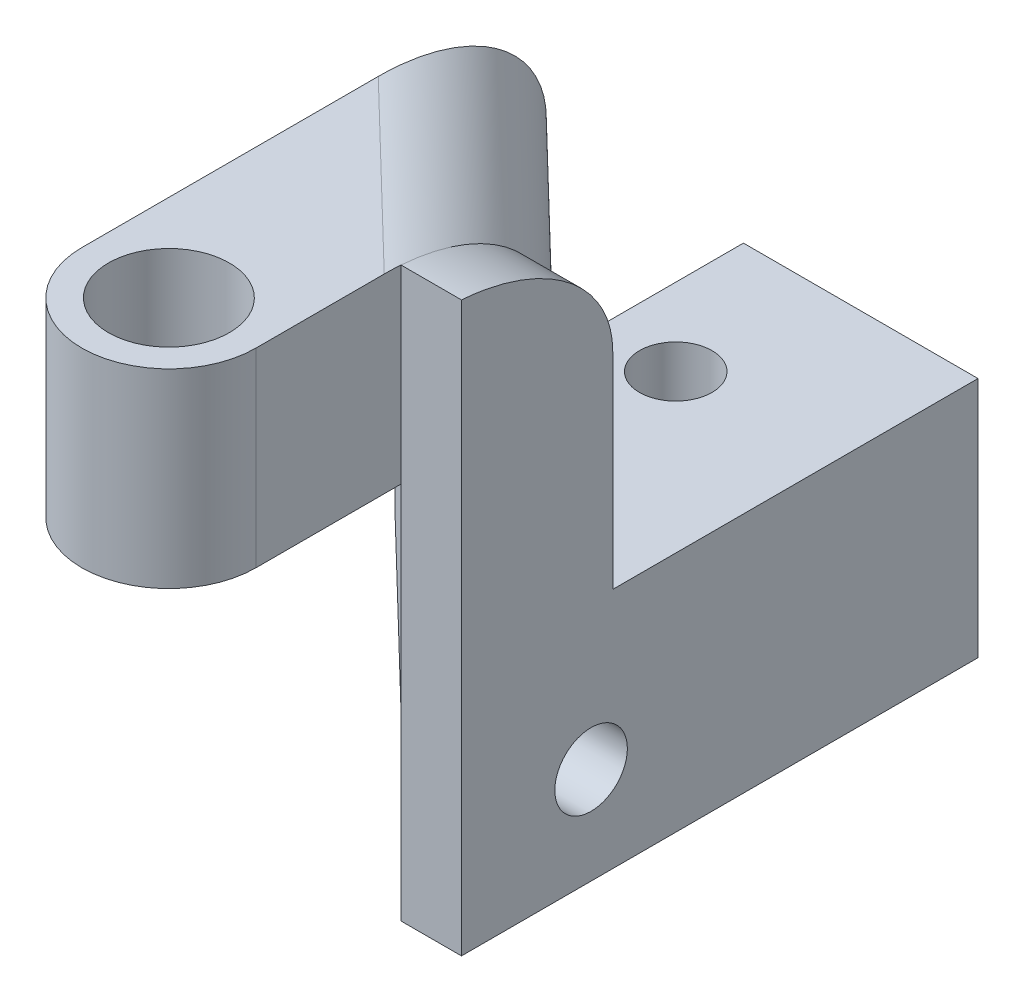
ISO-10303-21;
HEADER;
FILE_DESCRIPTION(('STEP AP214'),'2;1');
FILE_NAME('part.step','',(''),(''),'','','');
FILE_SCHEMA(('AUTOMOTIVE_DESIGN { 1 0 10303 214 1 1 1 1 }'));
ENDSEC;
DATA;
#1=APPLICATION_CONTEXT('core data for automotive mechanical design processes');
#2=APPLICATION_PROTOCOL_DEFINITION('international standard','automotive_design',2000,#1);
#3=PRODUCT_CONTEXT('',#1,'mechanical');
#4=PRODUCT('Part','Part','',(#3));
#5=PRODUCT_RELATED_PRODUCT_CATEGORY('part','',(#4));
#6=PRODUCT_DEFINITION_FORMATION('','',#4);
#7=PRODUCT_DEFINITION_CONTEXT('part definition',#1,'design');
#8=PRODUCT_DEFINITION('design','',#6,#7);
#9=PRODUCT_DEFINITION_SHAPE('','',#8);
#10=(LENGTH_UNIT() NAMED_UNIT(*) SI_UNIT(.MILLI.,.METRE.));
#11=(NAMED_UNIT(*) PLANE_ANGLE_UNIT() SI_UNIT($,.RADIAN.));
#12=(NAMED_UNIT(*) SI_UNIT($,.STERADIAN.) SOLID_ANGLE_UNIT());
#13=UNCERTAINTY_MEASURE_WITH_UNIT(LENGTH_MEASURE(1.E-05),#10,'distance_accuracy_value','');
#14=(GEOMETRIC_REPRESENTATION_CONTEXT(3) GLOBAL_UNCERTAINTY_ASSIGNED_CONTEXT((#13)) GLOBAL_UNIT_ASSIGNED_CONTEXT((#10,
#11,#12)) REPRESENTATION_CONTEXT('',''));
#15=CARTESIAN_POINT('',(0.,0.,0.));
#16=DIRECTION('',(0.,0.,1.));
#17=DIRECTION('',(1.,0.,0.));
#18=AXIS2_PLACEMENT_3D('',#15,#16,#17);
#19=CARTESIAN_POINT('',(4.73535338699276,2.5,-4.9036019787419));
#20=DIRECTION('',(0.694658370458993,0.,-0.719339800338655));
#21=DIRECTION('',(-0.719339800338655,0.,-0.694658370458993));
#22=AXIS2_PLACEMENT_3D('',#19,#20,#21);
#23=PLANE('',#22);
#24=DIRECTION('',(0.719339800338655,0.,0.694658370458993));
#25=VECTOR('',#24,1.);
#26=CARTESIAN_POINT('',(4.73535338699276,8.15,-4.9036019787419));
#27=LINE('',#26,#25);
#28=CARTESIAN_POINT('',(-3.6,8.15,-12.9529591786108));
#29=VERTEX_POINT('',#28);
#30=CARTESIAN_POINT('',(3.59999999999999,8.15,-6.));
#31=VERTEX_POINT('',#30);
#32=EDGE_CURVE('E180',#29,#31,#27,.T.);
#33=ORIENTED_EDGE('',*,*,#32,.F.);
#34=DIRECTION('',(0.,-1.,0.));
#35=VECTOR('',#34,1.);
#36=CARTESIAN_POINT('',(-3.6,2.5,-12.9529591786108));
#37=LINE('',#36,#35);
#38=CARTESIAN_POINT('',(-3.6,0.,-12.9529591786108));
#39=VERTEX_POINT('',#38);
#40=EDGE_CURVE('E228',#29,#39,#37,.T.);
#41=ORIENTED_EDGE('',*,*,#40,.T.);
#42=DIRECTION('',(0.719339800338655,0.,0.694658370458993));
#43=VECTOR('',#42,1.);
#44=CARTESIAN_POINT('',(4.73535338699276,0.,-4.9036019787419));
#45=LINE('',#44,#43);
#46=CARTESIAN_POINT('',(3.59999999999999,0.,-6.));
#47=VERTEX_POINT('',#46);
#48=EDGE_CURVE('E218',#39,#47,#45,.T.);
#49=ORIENTED_EDGE('',*,*,#48,.T.);
#50=DIRECTION('',(0.,-1.,0.));
#51=VECTOR('',#50,1.);
#52=CARTESIAN_POINT('',(3.59999999999999,2.5,-6.));
#53=LINE('',#52,#51);
#54=EDGE_CURVE('E211',#31,#47,#53,.T.);
#55=ORIENTED_EDGE('',*,*,#54,.F.);
#56=EDGE_LOOP('',(#33,#41,#49,#55));
#57=FACE_BOUND('',#56,.T.);
#58=ADVANCED_FACE('F41',(#57),#23,.F.);
#59=CARTESIAN_POINT('',(3.59999999999999,2.5,0.));
#60=DIRECTION('',(-1.,0.,0.));
#61=DIRECTION('',(0.,0.,1.));
#62=AXIS2_PLACEMENT_3D('',#59,#60,#61);
#63=PLANE('',#62);
#64=DIRECTION('',(0.,-1.,0.));
#65=VECTOR('',#64,1.);
#66=CARTESIAN_POINT('',(3.59999999999999,0.,-6.));
#67=LINE('',#66,#65);
#68=CARTESIAN_POINT('',(3.59999999999999,15.9949371855331,-6.));
#69=VERTEX_POINT('',#68);
#70=EDGE_CURVE('E57',#69,#31,#67,.T.);
#71=ORIENTED_EDGE('',*,*,#70,.F.);
#72=CARTESIAN_POINT('',(3.59999999999999,11.02,-5.30491820449167));
#73=DIRECTION('',(-1.,0.,0.));
#74=DIRECTION('',(0.,0.,1.));
#75=AXIS2_PLACEMENT_3D('',#72,#73,#74);
#76=ELLIPSE('',#75,6.95081795508336,5.);
#77=CARTESIAN_POINT('',(3.59999999999999,16.02,-5.30491820449166));
#78=VERTEX_POINT('',#77);
#79=EDGE_CURVE('E240',#69,#78,#76,.F.);
#80=ORIENTED_EDGE('',*,*,#79,.T.);
#81=DIRECTION('',(0.,0.,-1.));
#82=VECTOR('',#81,1.);
#83=CARTESIAN_POINT('',(3.59999999999999,16.02,0.));
#84=LINE('',#83,#82);
#85=CARTESIAN_POINT('',(3.59999999999999,16.02,0.));
#86=VERTEX_POINT('',#85);
#87=EDGE_CURVE('E197',#86,#78,#84,.T.);
#88=ORIENTED_EDGE('',*,*,#87,.F.);
#89=DIRECTION('',(0.,-1.,0.));
#90=VECTOR('',#89,1.);
#91=CARTESIAN_POINT('',(3.59999999999999,16.02,0.));
#92=LINE('',#91,#90);
#93=CARTESIAN_POINT('',(3.59999999999999,8.15,0.));
#94=VERTEX_POINT('',#93);
#95=EDGE_CURVE('E177',#86,#94,#92,.T.);
#96=ORIENTED_EDGE('',*,*,#95,.T.);
#97=DIRECTION('',(0.,0.,-1.));
#98=VECTOR('',#97,1.);
#99=CARTESIAN_POINT('',(3.59999999999999,8.15,0.));
#100=LINE('',#99,#98);
#101=EDGE_CURVE('E184',#94,#31,#100,.T.);
#102=ORIENTED_EDGE('',*,*,#101,.T.);
#103=EDGE_LOOP('',(#71,#80,#88,#96,#102));
#104=FACE_BOUND('',#103,.T.);
#105=ADVANCED_FACE('F242',(#104),#63,.F.);
#106=CARTESIAN_POINT('',(0.,2.5,-27.36));
#107=DIRECTION('',(0.,0.,1.));
#108=DIRECTION('',(1.,0.,0.));
#109=AXIS2_PLACEMENT_3D('',#106,#107,#108);
#110=PLANE('',#109);
#111=DIRECTION('',(-1.,0.,0.));
#112=VECTOR('',#111,1.);
#113=CARTESIAN_POINT('',(0.,0.,-27.36));
#114=LINE('',#113,#112);
#115=CARTESIAN_POINT('',(3.59999999999999,0.,-27.36));
#116=VERTEX_POINT('',#115);
#117=CARTESIAN_POINT('',(-3.6,0.,-27.36));
#118=VERTEX_POINT('',#117);
#119=EDGE_CURVE('E213',#116,#118,#114,.T.);
#120=ORIENTED_EDGE('',*,*,#119,.T.);
#121=DIRECTION('',(0.,-1.,0.));
#122=VECTOR('',#121,1.);
#123=CARTESIAN_POINT('',(-3.6,2.5,-27.36));
#124=LINE('',#123,#122);
#125=CARTESIAN_POINT('',(-3.6,2.5,-27.36));
#126=VERTEX_POINT('',#125);
#127=EDGE_CURVE('E226',#126,#118,#124,.T.);
#128=ORIENTED_EDGE('',*,*,#127,.F.);
#129=DIRECTION('',(-1.,0.,0.));
#130=VECTOR('',#129,1.);
#131=CARTESIAN_POINT('',(0.,2.5,-27.36));
#132=LINE('',#131,#130);
#133=CARTESIAN_POINT('',(6.09999999999999,2.5,-27.36));
#134=VERTEX_POINT('',#133);
#135=EDGE_CURVE('E144',#134,#126,#132,.T.);
#136=ORIENTED_EDGE('',*,*,#135,.F.);
#137=DIRECTION('',(0.,1.,0.));
#138=VECTOR('',#137,1.);
#139=CARTESIAN_POINT('',(6.09999999999999,0.,-27.36));
#140=LINE('',#139,#138);
#141=CARTESIAN_POINT('',(6.09999999999999,-7.5,-27.36));
#142=VERTEX_POINT('',#141);
#143=EDGE_CURVE('E136',#142,#134,#140,.T.);
#144=ORIENTED_EDGE('',*,*,#143,.F.);
#145=DIRECTION('',(-1.,0.,0.));
#146=VECTOR('',#145,1.);
#147=CARTESIAN_POINT('',(6.09999999999999,-7.5,-27.36));
#148=LINE('',#147,#146);
#149=CARTESIAN_POINT('',(3.59999999999999,-7.5,-27.36));
#150=VERTEX_POINT('',#149);
#151=EDGE_CURVE('E142',#142,#150,#148,.T.);
#152=ORIENTED_EDGE('',*,*,#151,.T.);
#153=DIRECTION('',(0.,1.,0.));
#154=VECTOR('',#153,1.);
#155=CARTESIAN_POINT('',(3.59999999999999,0.,-27.36));
#156=LINE('',#155,#154);
#157=EDGE_CURVE('E507',#150,#116,#156,.T.);
#158=ORIENTED_EDGE('',*,*,#157,.T.);
#159=EDGE_LOOP('',(#120,#128,#136,#144,#152,#158));
#160=FACE_BOUND('',#159,.T.);
#161=ADVANCED_FACE('F137',(#160),#110,.F.);
#162=CARTESIAN_POINT('',(-3.59999999999999,2.5,0.));
#163=DIRECTION('',(1.,0.,0.));
#164=DIRECTION('',(0.,0.,-1.));
#165=AXIS2_PLACEMENT_3D('',#162,#163,#164);
#166=PLANE('',#165);
#167=DIRECTION('',(0.,0.,1.));
#168=VECTOR('',#167,1.);
#169=CARTESIAN_POINT('',(-3.59999999999999,16.02,0.));
#170=LINE('',#169,#168);
#171=CARTESIAN_POINT('',(-3.59999999999999,16.02,-12.2578773831025));
#172=VERTEX_POINT('',#171);
#173=CARTESIAN_POINT('',(-3.59999999999999,16.02,0.));
#174=VERTEX_POINT('',#173);
#175=EDGE_CURVE('E194',#172,#174,#170,.T.);
#176=ORIENTED_EDGE('',*,*,#175,.F.);
#177=CARTESIAN_POINT('',(-3.59999999999999,11.02,-12.2578773831025));
#178=DIRECTION('',(1.,0.,0.));
#179=DIRECTION('',(0.,0.,1.));
#180=AXIS2_PLACEMENT_3D('',#177,#178,#179);
#181=ELLIPSE('',#180,6.95081795508336,5.);
#182=CARTESIAN_POINT('',(-3.6,11.02,-19.2086953381859));
#183=VERTEX_POINT('',#182);
#184=EDGE_CURVE('E11',#172,#183,#181,.F.);
#185=ORIENTED_EDGE('',*,*,#184,.T.);
#186=DIRECTION('',(0.,-1.,0.));
#187=VECTOR('',#186,1.);
#188=CARTESIAN_POINT('',(-3.6,31.0635910784963,-19.2086953381859));
#189=LINE('',#188,#187);
#190=CARTESIAN_POINT('',(-3.6,2.5,-19.2086953381859));
#191=VERTEX_POINT('',#190);
#192=EDGE_CURVE('E199',#183,#191,#189,.T.);
#193=ORIENTED_EDGE('',*,*,#192,.T.);
#194=DIRECTION('',(0.,0.,1.));
#195=VECTOR('',#194,1.);
#196=CARTESIAN_POINT('',(-3.59999999999999,2.5,0.));
#197=LINE('',#196,#195);
#198=EDGE_CURVE('E203',#126,#191,#197,.T.);
#199=ORIENTED_EDGE('',*,*,#198,.F.);
#200=ORIENTED_EDGE('',*,*,#127,.T.);
#201=DIRECTION('',(0.,0.,1.));
#202=VECTOR('',#201,1.);
#203=CARTESIAN_POINT('',(-3.59999999999999,0.,0.));
#204=LINE('',#203,#202);
#205=EDGE_CURVE('E216',#118,#39,#204,.T.);
#206=ORIENTED_EDGE('',*,*,#205,.T.);
#207=ORIENTED_EDGE('',*,*,#40,.F.);
#208=DIRECTION('',(0.,0.,1.));
#209=VECTOR('',#208,1.);
#210=CARTESIAN_POINT('',(-3.59999999999999,8.15,0.));
#211=LINE('',#210,#209);
#212=CARTESIAN_POINT('',(-3.59999999999999,8.15,0.));
#213=VERTEX_POINT('',#212);
#214=EDGE_CURVE('E168',#29,#213,#211,.T.);
#215=ORIENTED_EDGE('',*,*,#214,.T.);
#216=DIRECTION('',(0.,-1.,0.));
#217=VECTOR('',#216,1.);
#218=CARTESIAN_POINT('',(-3.59999999999999,16.02,0.));
#219=LINE('',#218,#217);
#220=EDGE_CURVE('E191',#174,#213,#219,.T.);
#221=ORIENTED_EDGE('',*,*,#220,.F.);
#222=EDGE_LOOP('',(#176,#185,#193,#199,#200,#206,#207,#215,#221));
#223=FACE_BOUND('',#222,.T.);
#224=ADVANCED_FACE('F251',(#223),#166,.F.);
#225=CARTESIAN_POINT('',(-0.400000000000008,2.5,-21.36));
#226=DIRECTION('',(0.,-1.,0.));
#227=DIRECTION('',(0.,0.,-1.));
#228=AXIS2_PLACEMENT_3D('',#225,#226,#227);
#229=CYLINDRICAL_SURFACE('',#228,1.5);
#230=CARTESIAN_POINT('',(-0.400000000000008,2.5,-21.36));
#231=DIRECTION('',(0.,1.,0.));
#232=DIRECTION('',(0.,0.,1.));
#233=AXIS2_PLACEMENT_3D('',#230,#231,#232);
#234=CIRCLE('',#233,1.5);
#235=CARTESIAN_POINT('',(-0.400000000000008,2.5,-19.86));
#236=VERTEX_POINT('',#235);
#237=EDGE_CURVE('E206',#236,#236,#234,.T.);
#238=ORIENTED_EDGE('',*,*,#237,.T.);
#239=EDGE_LOOP('',(#238));
#240=FACE_BOUND('',#239,.T.);
#241=CARTESIAN_POINT('',(-0.400000000000008,0.,-21.36));
#242=DIRECTION('',(0.,1.,0.));
#243=DIRECTION('',(0.,0.,1.));
#244=AXIS2_PLACEMENT_3D('',#241,#242,#243);
#245=CIRCLE('',#244,1.5);
#246=CARTESIAN_POINT('',(-0.400000000000008,0.,-19.86));
#247=VERTEX_POINT('',#246);
#248=EDGE_CURVE('E204',#247,#247,#245,.T.);
#249=ORIENTED_EDGE('',*,*,#248,.F.);
#250=EDGE_LOOP('',(#249));
#251=FACE_BOUND('',#250,.T.);
#252=ADVANCED_FACE('F312',(#240,#251),#229,.F.);
#253=CARTESIAN_POINT('',(0.,2.5,0.));
#254=DIRECTION('',(0.,1.,0.));
#255=DIRECTION('',(0.,0.,1.));
#256=AXIS2_PLACEMENT_3D('',#253,#254,#255);
#257=PLANE('',#256);
#258=DIRECTION('',(-0.719339800338655,0.,-0.694658370458993));
#259=VECTOR('',#258,1.);
#260=CARTESIAN_POINT('',(7.86131605405823,2.5,-8.14063108026585));
#261=LINE('',#260,#259);
#262=CARTESIAN_POINT('',(3.59999999999999,2.5,-12.255736159575));
#263=VERTEX_POINT('',#262);
#264=EDGE_CURVE('E233',#263,#191,#261,.T.);
#265=ORIENTED_EDGE('',*,*,#264,.F.);
#266=DIRECTION('',(-1.,0.,0.));
#267=VECTOR('',#266,1.);
#268=CARTESIAN_POINT('',(6.09999999999999,2.5,-12.255736159575));
#269=LINE('',#268,#267);
#270=CARTESIAN_POINT('',(6.09999999999999,2.5,-12.255736159575));
#271=VERTEX_POINT('',#270);
#272=EDGE_CURVE('E161',#271,#263,#269,.T.);
#273=ORIENTED_EDGE('',*,*,#272,.F.);
#274=DIRECTION('',(0.,0.,1.));
#275=VECTOR('',#274,1.);
#276=CARTESIAN_POINT('',(6.09999999999999,2.5,0.));
#277=LINE('',#276,#275);
#278=EDGE_CURVE('E150',#134,#271,#277,.T.);
#279=ORIENTED_EDGE('',*,*,#278,.F.);
#280=ORIENTED_EDGE('',*,*,#135,.T.);
#281=ORIENTED_EDGE('',*,*,#198,.T.);
#282=EDGE_LOOP('',(#265,#273,#279,#280,#281));
#283=FACE_BOUND('',#282,.T.);
#284=ORIENTED_EDGE('',*,*,#237,.F.);
#285=EDGE_LOOP('',(#284));
#286=FACE_BOUND('',#285,.T.);
#287=ADVANCED_FACE('F264',(#283,#286),#257,.T.);
#288=CARTESIAN_POINT('',(0.,0.,0.));
#289=DIRECTION('',(0.,1.,0.));
#290=DIRECTION('',(0.,0.,1.));
#291=AXIS2_PLACEMENT_3D('',#288,#289,#290);
#292=PLANE('',#291);
#293=ORIENTED_EDGE('',*,*,#48,.F.);
#294=ORIENTED_EDGE('',*,*,#205,.F.);
#295=ORIENTED_EDGE('',*,*,#119,.F.);
#296=DIRECTION('',(0.,0.,-1.));
#297=VECTOR('',#296,1.);
#298=CARTESIAN_POINT('',(3.59999999999999,0.,0.));
#299=LINE('',#298,#297);
#300=EDGE_CURVE('E200',#47,#116,#299,.T.);
#301=ORIENTED_EDGE('',*,*,#300,.F.);
#302=EDGE_LOOP('',(#293,#294,#295,#301));
#303=FACE_BOUND('',#302,.T.);
#304=ORIENTED_EDGE('',*,*,#248,.T.);
#305=EDGE_LOOP('',(#304));
#306=FACE_BOUND('',#305,.T.);
#307=ADVANCED_FACE('F308',(#303,#306),#292,.F.);
#308=CARTESIAN_POINT('',(7.86131605405823,31.0635910784963,-8.14063108026585));
#309=DIRECTION('',(0.694658370458993,0.,-0.719339800338655));
#310=DIRECTION('',(-0.719339800338655,0.,-0.694658370458993));
#311=AXIS2_PLACEMENT_3D('',#308,#309,#310);
#312=PLANE('',#311);
#313=ORIENTED_EDGE('',*,*,#192,.F.);
#314=DIRECTION('',(0.719339800338655,0.,0.694658370458993));
#315=VECTOR('',#314,1.);
#316=CARTESIAN_POINT('',(7.86131605405823,11.02,-8.14063108026585));
#317=LINE('',#316,#315);
#318=CARTESIAN_POINT('',(3.59999999999999,11.02,-12.255736159575));
#319=VERTEX_POINT('',#318);
#320=EDGE_CURVE('E234',#183,#319,#317,.T.);
#321=ORIENTED_EDGE('',*,*,#320,.T.);
#322=DIRECTION('',(0.,-1.,0.));
#323=VECTOR('',#322,1.);
#324=CARTESIAN_POINT('',(3.59999999999999,31.0635910784963,-12.255736159575));
#325=LINE('',#324,#323);
#326=EDGE_CURVE('E193',#319,#263,#325,.T.);
#327=ORIENTED_EDGE('',*,*,#326,.T.);
#328=ORIENTED_EDGE('',*,*,#264,.T.);
#329=EDGE_LOOP('',(#313,#321,#327,#328));
#330=FACE_BOUND('',#329,.T.);
#331=ADVANCED_FACE('F257',(#330),#312,.T.);
#332=CARTESIAN_POINT('',(0.,16.02,0.));
#333=DIRECTION('',(0.,1.,0.));
#334=DIRECTION('',(0.,0.,1.));
#335=AXIS2_PLACEMENT_3D('',#332,#333,#334);
#336=PLANE('',#335);
#337=ORIENTED_EDGE('',*,*,#87,.T.);
#338=DIRECTION('',(0.719339800338655,0.,0.694658370458993));
#339=VECTOR('',#338,1.);
#340=CARTESIAN_POINT('',(4.38802420176326,16.02,-4.54393207857257));
#341=LINE('',#340,#339);
#342=EDGE_CURVE('E47',#78,#172,#341,.F.);
#343=ORIENTED_EDGE('',*,*,#342,.T.);
#344=ORIENTED_EDGE('',*,*,#175,.T.);
#345=CARTESIAN_POINT('',(0.,16.02,0.));
#346=DIRECTION('',(0.,1.,0.));
#347=DIRECTION('',(0.,0.,1.));
#348=AXIS2_PLACEMENT_3D('',#345,#346,#347);
#349=CIRCLE('',#348,3.59999999999999);
#350=EDGE_CURVE('E176',#174,#86,#349,.T.);
#351=ORIENTED_EDGE('',*,*,#350,.T.);
#352=EDGE_LOOP('',(#337,#343,#344,#351));
#353=FACE_BOUND('',#352,.T.);
#354=CARTESIAN_POINT('',(0.,16.02,0.));
#355=DIRECTION('',(0.,1.,0.));
#356=DIRECTION('',(0.,0.,1.));
#357=AXIS2_PLACEMENT_3D('',#354,#355,#356);
#358=CIRCLE('',#357,2.5);
#359=CARTESIAN_POINT('',(0.,16.02,2.5));
#360=VERTEX_POINT('',#359);
#361=EDGE_CURVE('E173',#360,#360,#358,.T.);
#362=ORIENTED_EDGE('',*,*,#361,.F.);
#363=EDGE_LOOP('',(#362));
#364=FACE_BOUND('',#363,.T.);
#365=ADVANCED_FACE('F246',(#353,#364),#336,.T.);
#366=CARTESIAN_POINT('',(0.,16.02,0.));
#367=DIRECTION('',(0.,-1.,0.));
#368=DIRECTION('',(0.,0.,-1.));
#369=AXIS2_PLACEMENT_3D('',#366,#367,#368);
#370=CYLINDRICAL_SURFACE('',#369,3.59999999999999);
#371=CARTESIAN_POINT('',(0.,8.15,0.));
#372=DIRECTION('',(0.,1.,0.));
#373=DIRECTION('',(0.,0.,1.));
#374=AXIS2_PLACEMENT_3D('',#371,#372,#373);
#375=CIRCLE('',#374,3.59999999999999);
#376=EDGE_CURVE('E182',#213,#94,#375,.T.);
#377=ORIENTED_EDGE('',*,*,#376,.T.);
#378=ORIENTED_EDGE('',*,*,#95,.F.);
#379=ORIENTED_EDGE('',*,*,#350,.F.);
#380=ORIENTED_EDGE('',*,*,#220,.T.);
#381=EDGE_LOOP('',(#377,#378,#379,#380));
#382=FACE_BOUND('',#381,.T.);
#383=ADVANCED_FACE('F299',(#382),#370,.T.);
#384=CARTESIAN_POINT('',(0.,16.02,0.));
#385=DIRECTION('',(0.,-1.,0.));
#386=DIRECTION('',(0.,0.,-1.));
#387=AXIS2_PLACEMENT_3D('',#384,#385,#386);
#388=CYLINDRICAL_SURFACE('',#387,2.5);
#389=ORIENTED_EDGE('',*,*,#361,.T.);
#390=EDGE_LOOP('',(#389));
#391=FACE_BOUND('',#390,.T.);
#392=CARTESIAN_POINT('',(0.,8.15,0.));
#393=DIRECTION('',(0.,1.,0.));
#394=DIRECTION('',(0.,0.,1.));
#395=AXIS2_PLACEMENT_3D('',#392,#393,#394);
#396=CIRCLE('',#395,2.5);
#397=CARTESIAN_POINT('',(0.,8.15,2.5));
#398=VERTEX_POINT('',#397);
#399=EDGE_CURVE('E162',#398,#398,#396,.T.);
#400=ORIENTED_EDGE('',*,*,#399,.F.);
#401=EDGE_LOOP('',(#400));
#402=FACE_BOUND('',#401,.T.);
#403=ADVANCED_FACE('F300',(#391,#402),#388,.F.);
#404=CARTESIAN_POINT('',(0.,8.15,0.));
#405=DIRECTION('',(0.,1.,0.));
#406=DIRECTION('',(0.,0.,1.));
#407=AXIS2_PLACEMENT_3D('',#404,#405,#406);
#408=PLANE('',#407);
#409=ORIENTED_EDGE('',*,*,#399,.T.);
#410=EDGE_LOOP('',(#409));
#411=FACE_BOUND('',#410,.T.);
#412=ORIENTED_EDGE('',*,*,#214,.F.);
#413=ORIENTED_EDGE('',*,*,#32,.T.);
#414=ORIENTED_EDGE('',*,*,#101,.F.);
#415=ORIENTED_EDGE('',*,*,#376,.F.);
#416=EDGE_LOOP('',(#412,#413,#414,#415));
#417=FACE_BOUND('',#416,.T.);
#418=ADVANCED_FACE('F295',(#411,#417),#408,.F.);
#419=CARTESIAN_POINT('',(4.38802420176326,11.02,-4.54393207857258));
#420=DIRECTION('',(0.719339800338655,0.,0.694658370458993));
#421=DIRECTION('',(0.694658370458993,0.,-0.719339800338655));
#422=AXIS2_PLACEMENT_3D('',#419,#420,#421);
#423=CYLINDRICAL_SURFACE('',#422,5.);
#424=ORIENTED_EDGE('',*,*,#184,.F.);
#425=ORIENTED_EDGE('',*,*,#342,.F.);
#426=ORIENTED_EDGE('',*,*,#79,.F.);
#427=EDGE_CURVE('E238',#319,#69,#76,.F.);
#428=ORIENTED_EDGE('',*,*,#427,.F.);
#429=ORIENTED_EDGE('',*,*,#320,.F.);
#430=EDGE_LOOP('',(#424,#425,#426,#428,#429));
#431=FACE_BOUND('',#430,.T.);
#432=ADVANCED_FACE('F43',(#431),#423,.T.);
#433=CARTESIAN_POINT('',(3.59999999999999,0.,0.));
#434=DIRECTION('',(1.,0.,0.));
#435=DIRECTION('',(0.,0.,-1.));
#436=AXIS2_PLACEMENT_3D('',#433,#434,#435);
#437=PLANE('',#436);
#438=CARTESIAN_POINT('',(3.59999999999999,-3.5,-11.36));
#439=DIRECTION('',(1.,0.,0.));
#440=DIRECTION('',(0.,0.,-1.));
#441=AXIS2_PLACEMENT_3D('',#438,#439,#440);
#442=CIRCLE('',#441,1.5);
#443=CARTESIAN_POINT('',(3.59999999999999,-3.5,-12.86));
#444=VERTEX_POINT('',#443);
#445=EDGE_CURVE('E520',#444,#444,#442,.T.);
#446=ORIENTED_EDGE('',*,*,#445,.T.);
#447=EDGE_LOOP('',(#446));
#448=FACE_BOUND('',#447,.T.);
#449=CARTESIAN_POINT('',(3.59999999999999,-7.5,-6.));
#450=VERTEX_POINT('',#449);
#451=EDGE_CURVE('E506',#47,#450,#67,.T.);
#452=ORIENTED_EDGE('',*,*,#451,.F.);
#453=ORIENTED_EDGE('',*,*,#300,.T.);
#454=ORIENTED_EDGE('',*,*,#157,.F.);
#455=DIRECTION('',(0.,0.,-1.));
#456=VECTOR('',#455,1.);
#457=CARTESIAN_POINT('',(3.59999999999999,-7.5,0.));
#458=LINE('',#457,#456);
#459=EDGE_CURVE('E163',#450,#150,#458,.T.);
#460=ORIENTED_EDGE('',*,*,#459,.F.);
#461=EDGE_LOOP('',(#452,#453,#454,#460));
#462=FACE_BOUND('',#461,.T.);
#463=ADVANCED_FACE('F289',(#448,#462),#437,.F.);
#464=CARTESIAN_POINT('',(6.09999999999999,-7.5,0.));
#465=DIRECTION('',(0.,1.,0.));
#466=DIRECTION('',(0.,0.,1.));
#467=AXIS2_PLACEMENT_3D('',#464,#465,#466);
#468=PLANE('',#467);
#469=ORIENTED_EDGE('',*,*,#459,.T.);
#470=ORIENTED_EDGE('',*,*,#151,.F.);
#471=DIRECTION('',(0.,0.,-1.));
#472=VECTOR('',#471,1.);
#473=CARTESIAN_POINT('',(6.09999999999999,-7.5,0.));
#474=LINE('',#473,#472);
#475=CARTESIAN_POINT('',(6.09999999999999,-7.5,-6.));
#476=VERTEX_POINT('',#475);
#477=EDGE_CURVE('E147',#476,#142,#474,.T.);
#478=ORIENTED_EDGE('',*,*,#477,.F.);
#479=DIRECTION('',(-1.,0.,0.));
#480=VECTOR('',#479,1.);
#481=CARTESIAN_POINT('',(6.09999999999999,-7.5,-6.));
#482=LINE('',#481,#480);
#483=EDGE_CURVE('E515',#476,#450,#482,.T.);
#484=ORIENTED_EDGE('',*,*,#483,.T.);
#485=EDGE_LOOP('',(#469,#470,#478,#484));
#486=FACE_BOUND('',#485,.T.);
#487=ADVANCED_FACE('F158',(#486),#468,.F.);
#488=CARTESIAN_POINT('',(6.09999999999999,0.,-12.255736159575));
#489=DIRECTION('',(0.,0.,1.));
#490=DIRECTION('',(1.,0.,0.));
#491=AXIS2_PLACEMENT_3D('',#488,#489,#490);
#492=PLANE('',#491);
#493=ORIENTED_EDGE('',*,*,#326,.F.);
#494=DIRECTION('',(-1.,0.,0.));
#495=VECTOR('',#494,1.);
#496=CARTESIAN_POINT('',(6.09999999999999,11.02,-12.255736159575));
#497=LINE('',#496,#495);
#498=CARTESIAN_POINT('',(6.09999999999999,11.02,-12.255736159575));
#499=VERTEX_POINT('',#498);
#500=EDGE_CURVE('E169',#499,#319,#497,.T.);
#501=ORIENTED_EDGE('',*,*,#500,.F.);
#502=DIRECTION('',(0.,1.,0.));
#503=VECTOR('',#502,1.);
#504=CARTESIAN_POINT('',(6.09999999999999,0.,-12.255736159575));
#505=LINE('',#504,#503);
#506=EDGE_CURVE('E268',#271,#499,#505,.T.);
#507=ORIENTED_EDGE('',*,*,#506,.F.);
#508=ORIENTED_EDGE('',*,*,#272,.T.);
#509=EDGE_LOOP('',(#493,#501,#507,#508));
#510=FACE_BOUND('',#509,.T.);
#511=ADVANCED_FACE('F270',(#510),#492,.F.);
#512=CARTESIAN_POINT('',(6.09999999999999,11.02,-5.30491820449167));
#513=DIRECTION('',(1.,0.,0.));
#514=DIRECTION('',(0.,0.,1.));
#515=AXIS2_PLACEMENT_3D('',#512,#513,#514);
#516=ELLIPSE('',#515,6.95081795508336,5.);
#517=DIRECTION('',(-1.,0.,0.));
#518=VECTOR('',#517,1.);
#519=SURFACE_OF_LINEAR_EXTRUSION('',#516,#518);
#520=ORIENTED_EDGE('',*,*,#427,.T.);
#521=DIRECTION('',(-1.,0.,0.));
#522=VECTOR('',#521,1.);
#523=CARTESIAN_POINT('',(6.09999999999999,15.9949371855331,-6.));
#524=LINE('',#523,#522);
#525=CARTESIAN_POINT('',(6.09999999999999,15.9949371855331,-6.));
#526=VERTEX_POINT('',#525);
#527=EDGE_CURVE('E511',#526,#69,#524,.T.);
#528=ORIENTED_EDGE('',*,*,#527,.F.);
#529=EDGE_CURVE('E272',#499,#526,#516,.T.);
#530=ORIENTED_EDGE('',*,*,#529,.F.);
#531=ORIENTED_EDGE('',*,*,#500,.T.);
#532=EDGE_LOOP('',(#520,#528,#530,#531));
#533=FACE_BOUND('',#532,.T.);
#534=ADVANCED_FACE('F278',(#533),#519,.F.);
#535=CARTESIAN_POINT('',(6.09999999999999,-3.5,-11.36));
#536=DIRECTION('',(-1.,0.,0.));
#537=DIRECTION('',(0.,0.,1.));
#538=AXIS2_PLACEMENT_3D('',#535,#536,#537);
#539=CYLINDRICAL_SURFACE('',#538,1.5);
#540=CARTESIAN_POINT('',(6.09999999999999,-3.5,-11.36));
#541=DIRECTION('',(1.,0.,0.));
#542=DIRECTION('',(0.,0.,-1.));
#543=AXIS2_PLACEMENT_3D('',#540,#541,#542);
#544=CIRCLE('',#543,1.5);
#545=CARTESIAN_POINT('',(6.09999999999999,-3.5,-12.86));
#546=VERTEX_POINT('',#545);
#547=EDGE_CURVE('E160',#546,#546,#544,.T.);
#548=ORIENTED_EDGE('',*,*,#547,.T.);
#549=EDGE_LOOP('',(#548));
#550=FACE_BOUND('',#549,.T.);
#551=ORIENTED_EDGE('',*,*,#445,.F.);
#552=EDGE_LOOP('',(#551));
#553=FACE_BOUND('',#552,.T.);
#554=ADVANCED_FACE('F284',(#550,#553),#539,.F.);
#555=CARTESIAN_POINT('',(6.09999999999999,0.,-6.));
#556=DIRECTION('',(0.,0.,-1.));
#557=DIRECTION('',(0.,1.,0.));
#558=AXIS2_PLACEMENT_3D('',#555,#556,#557);
#559=PLANE('',#558);
#560=ORIENTED_EDGE('',*,*,#70,.T.);
#561=ORIENTED_EDGE('',*,*,#54,.T.);
#562=ORIENTED_EDGE('',*,*,#451,.T.);
#563=ORIENTED_EDGE('',*,*,#483,.F.);
#564=DIRECTION('',(0.,-1.,0.));
#565=VECTOR('',#564,1.);
#566=CARTESIAN_POINT('',(6.09999999999999,0.,-6.));
#567=LINE('',#566,#565);
#568=EDGE_CURVE('E154',#526,#476,#567,.T.);
#569=ORIENTED_EDGE('',*,*,#568,.F.);
#570=ORIENTED_EDGE('',*,*,#527,.T.);
#571=EDGE_LOOP('',(#560,#561,#562,#563,#569,#570));
#572=FACE_BOUND('',#571,.T.);
#573=ADVANCED_FACE('F283',(#572),#559,.F.);
#574=CARTESIAN_POINT('',(6.09999999999999,0.,0.));
#575=DIRECTION('',(1.,0.,0.));
#576=DIRECTION('',(0.,0.,-1.));
#577=AXIS2_PLACEMENT_3D('',#574,#575,#576);
#578=PLANE('',#577);
#579=ORIENTED_EDGE('',*,*,#547,.F.);
#580=EDGE_LOOP('',(#579));
#581=FACE_BOUND('',#580,.T.);
#582=ORIENTED_EDGE('',*,*,#477,.T.);
#583=ORIENTED_EDGE('',*,*,#143,.T.);
#584=ORIENTED_EDGE('',*,*,#278,.T.);
#585=ORIENTED_EDGE('',*,*,#506,.T.);
#586=ORIENTED_EDGE('',*,*,#529,.T.);
#587=ORIENTED_EDGE('',*,*,#568,.T.);
#588=EDGE_LOOP('',(#582,#583,#584,#585,#586,#587));
#589=FACE_BOUND('',#588,.T.);
#590=ADVANCED_FACE('F151',(#581,#589),#578,.T.);
#591=CLOSED_SHELL('',(#58,#105,#161,#224,#252,#287,#307,#331,#365,#383,#403,#418,#432,#463,#487,
#511,#534,#554,#573,#590));
#592=MANIFOLD_SOLID_BREP('B2',#591);
#593=ADVANCED_BREP_SHAPE_REPRESENTATION('',(#18,#592),#14);
#594=SHAPE_DEFINITION_REPRESENTATION(#9,#593);
ENDSEC;
END-ISO-10303-21;
